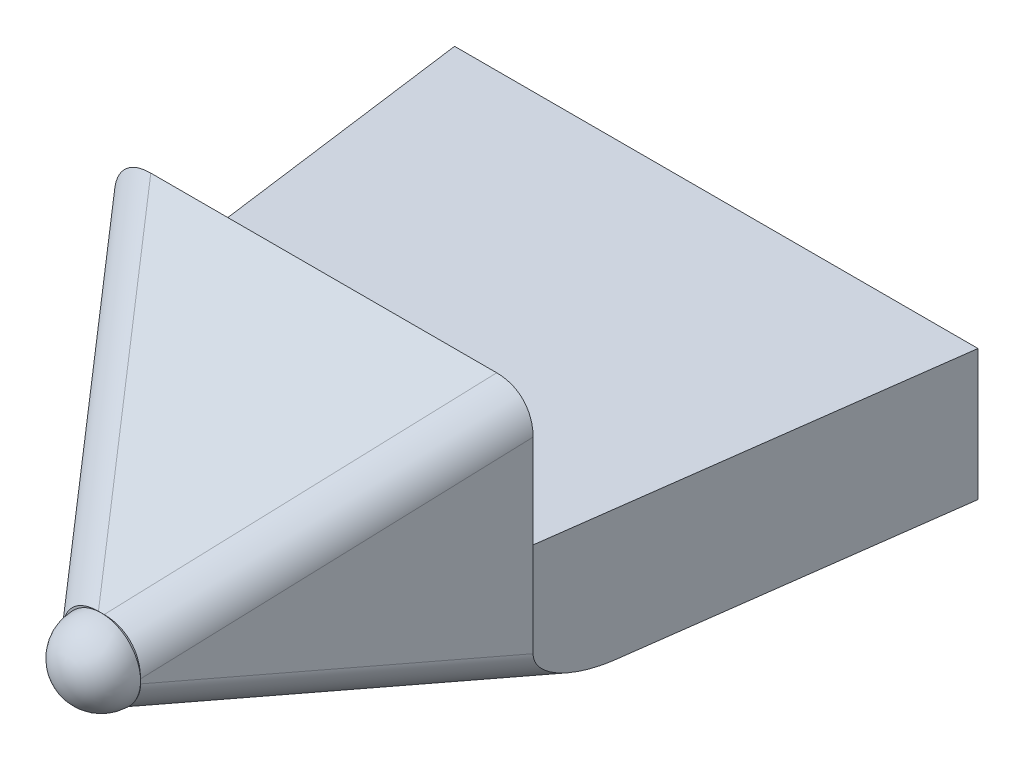
ISO-10303-21;
HEADER;
FILE_DESCRIPTION(('STEP AP214'),'2;1');
FILE_NAME('part.step','',(''),(''),'','','');
FILE_SCHEMA(('AUTOMOTIVE_DESIGN { 1 0 10303 214 1 1 1 1 }'));
ENDSEC;
DATA;
#1=APPLICATION_CONTEXT('core data for automotive mechanical design processes');
#2=APPLICATION_PROTOCOL_DEFINITION('international standard','automotive_design',2000,#1);
#3=PRODUCT_CONTEXT('',#1,'mechanical');
#4=PRODUCT('Part','Part','',(#3));
#5=PRODUCT_RELATED_PRODUCT_CATEGORY('part','',(#4));
#6=PRODUCT_DEFINITION_FORMATION('','',#4);
#7=PRODUCT_DEFINITION_CONTEXT('part definition',#1,'design');
#8=PRODUCT_DEFINITION('design','',#6,#7);
#9=PRODUCT_DEFINITION_SHAPE('','',#8);
#10=(LENGTH_UNIT() NAMED_UNIT(*) SI_UNIT(.MILLI.,.METRE.));
#11=(NAMED_UNIT(*) PLANE_ANGLE_UNIT() SI_UNIT($,.RADIAN.));
#12=(NAMED_UNIT(*) SI_UNIT($,.STERADIAN.) SOLID_ANGLE_UNIT());
#13=UNCERTAINTY_MEASURE_WITH_UNIT(LENGTH_MEASURE(1.E-05),#10,'distance_accuracy_value','');
#14=(GEOMETRIC_REPRESENTATION_CONTEXT(3) GLOBAL_UNCERTAINTY_ASSIGNED_CONTEXT((#13)) GLOBAL_UNIT_ASSIGNED_CONTEXT((#10,
#11,#12)) REPRESENTATION_CONTEXT('',''));
#15=CARTESIAN_POINT('',(0.,0.,0.));
#16=DIRECTION('',(0.,0.,1.));
#17=DIRECTION('',(1.,0.,0.));
#18=AXIS2_PLACEMENT_3D('',#15,#16,#17);
#19=CARTESIAN_POINT('',(850.,1360.,618.303571428571));
#20=DIRECTION('',(0.,0.,1.));
#21=DIRECTION('',(1.,0.,0.));
#22=AXIS2_PLACEMENT_3D('',#19,#20,#21);
#23=PLANE('',#22);
#24=CARTESIAN_POINT('',(1000.,-91.0714285714272,618.303571428571));
#25=DIRECTION('',(0.,0.,1.));
#26=DIRECTION('',(1.,0.,0.));
#27=AXIS2_PLACEMENT_3D('',#24,#25,#26);
#28=CIRCLE('',#27,149.999999999998);
#29=CARTESIAN_POINT('',(1150.,-91.0714285714272,618.303571428571));
#30=VERTEX_POINT('',#29);
#31=CARTESIAN_POINT('',(1130.26166991216,-165.448154445155,618.303571428571));
#32=VERTEX_POINT('',#31);
#33=EDGE_CURVE('E157',#30,#32,#28,.F.);
#34=ORIENTED_EDGE('',*,*,#33,.T.);
#35=CARTESIAN_POINT('',(973.757009513848,-101.071428571429,618.303571428571));
#36=DIRECTION('',(0.,0.,1.));
#37=DIRECTION('',(-1.,0.,0.));
#38=AXIS2_PLACEMENT_3D('',#35,#36,#37);
#39=ELLIPSE('',#38,176.242990486152,140.);
#40=CARTESIAN_POINT('',(1150.,-101.071428571429,618.303571428571));
#41=VERTEX_POINT('',#40);
#42=EDGE_CURVE('E195',#32,#41,#39,.T.);
#43=ORIENTED_EDGE('',*,*,#42,.T.);
#44=DIRECTION('',(0.,-1.,0.));
#45=VECTOR('',#44,1.);
#46=CARTESIAN_POINT('',(1150.,1360.,618.303571428571));
#47=LINE('',#46,#45);
#48=EDGE_CURVE('E402',#30,#41,#47,.T.);
#49=ORIENTED_EDGE('',*,*,#48,.F.);
#50=EDGE_LOOP('',(#34,#43,#49));
#51=FACE_BOUND('',#50,.T.);
#52=ADVANCED_FACE('F39',(#51),#23,.T.);
#53=DIRECTION('',(0.,-1.,0.));
#54=VECTOR('',#53,1.);
#55=CARTESIAN_POINT('',(850.,1360.,618.303571428571));
#56=LINE('',#55,#54);
#57=CARTESIAN_POINT('',(850.,-91.0714285714272,618.303571428571));
#58=VERTEX_POINT('',#57);
#59=CARTESIAN_POINT('',(850.,-101.071428571429,618.303571428571));
#60=VERTEX_POINT('',#59);
#61=EDGE_CURVE('E159',#58,#60,#56,.T.);
#62=ORIENTED_EDGE('',*,*,#61,.T.);
#63=CARTESIAN_POINT('',(1026.24299048615,-101.071428571429,618.303571428572));
#64=DIRECTION('',(0.,0.,1.));
#65=DIRECTION('',(-1.,0.,0.));
#66=AXIS2_PLACEMENT_3D('',#63,#64,#65);
#67=ELLIPSE('',#66,176.242990486152,140.);
#68=CARTESIAN_POINT('',(869.738330087826,-165.448154445129,618.303571428571));
#69=VERTEX_POINT('',#68);
#70=EDGE_CURVE('E200',#60,#69,#67,.T.);
#71=ORIENTED_EDGE('',*,*,#70,.T.);
#72=EDGE_CURVE('E167',#69,#58,#28,.F.);
#73=ORIENTED_EDGE('',*,*,#72,.T.);
#74=EDGE_LOOP('',(#62,#71,#73));
#75=FACE_BOUND('',#74,.T.);
#76=ADVANCED_FACE('F245',(#75),#23,.T.);
#77=DIRECTION('',(-1.,0.,0.));
#78=VECTOR('',#77,1.);
#79=CARTESIAN_POINT('',(2000.,58.9285714285711,618.303571428572));
#80=LINE('',#79,#78);
#81=CARTESIAN_POINT('',(1000.,58.9285714285712,618.303571428571));
#82=VERTEX_POINT('',#81);
#83=CARTESIAN_POINT('',(989.094896995936,58.9285714285711,618.303571428572));
#84=VERTEX_POINT('',#83);
#85=EDGE_CURVE('E146',#82,#84,#80,.T.);
#86=ORIENTED_EDGE('',*,*,#85,.T.);
#87=CARTESIAN_POINT('',(1076.59813062505,-174.253122583085,618.303571428571));
#88=DIRECTION('',(0.,0.,1.));
#89=DIRECTION('',(0.680451099367278,-0.732793491626299,0.));
#90=AXIS2_PLACEMENT_3D('',#87,#88,#89);
#91=ELLIPSE('',#90,270.777427465647,180.);
#92=CARTESIAN_POINT('',(850.,-84.2075772255309,618.303571428571));
#93=VERTEX_POINT('',#92);
#94=EDGE_CURVE('E11',#84,#93,#91,.T.);
#95=ORIENTED_EDGE('',*,*,#94,.T.);
#96=EDGE_CURVE('E163',#93,#58,#56,.T.);
#97=ORIENTED_EDGE('',*,*,#96,.T.);
#98=EDGE_CURVE('E156',#58,#82,#28,.F.);
#99=ORIENTED_EDGE('',*,*,#98,.T.);
#100=EDGE_LOOP('',(#86,#95,#97,#99));
#101=FACE_BOUND('',#100,.T.);
#102=ADVANCED_FACE('F162',(#101),#23,.T.);
#103=CARTESIAN_POINT('',(2000.,-241.071428571429,-1731.69642857143));
#104=DIRECTION('',(0.,1.,0.));
#105=DIRECTION('',(0.,0.,1.));
#106=AXIS2_PLACEMENT_3D('',#103,#104,#105);
#107=PLANE('',#106);
#108=CARTESIAN_POINT('',(1000.,-241.071428571429,-816.014185361011));
#109=DIRECTION('',(0.,-1.,0.));
#110=DIRECTION('',(0.,0.,-1.));
#111=AXIS2_PLACEMENT_3D('',#108,#109,#110);
#112=CIRCLE('',#111,400.);
#113=CARTESIAN_POINT('',(1000.,-241.071428571429,-1216.01418536101));
#114=VERTEX_POINT('',#113);
#115=EDGE_CURVE('E279',#114,#114,#112,.T.);
#116=ORIENTED_EDGE('',*,*,#115,.F.);
#117=EDGE_LOOP('',(#116));
#118=FACE_BOUND('',#117,.T.);
#119=DIRECTION('',(0.132163720091018,0.,-0.991227900682635));
#120=VECTOR('',#119,1.);
#121=CARTESIAN_POINT('',(2000.,-241.071428571429,-1731.69642857143));
#122=LINE('',#121,#120);
#123=CARTESIAN_POINT('',(1837.2190166244,-241.071428571429,-510.839053254464));
#124=VERTEX_POINT('',#123);
#125=CARTESIAN_POINT('',(2000.,-241.071428571429,-1731.69642857143));
#126=VERTEX_POINT('',#125);
#127=EDGE_CURVE('E282',#124,#126,#122,.T.);
#128=ORIENTED_EDGE('',*,*,#127,.F.);
#129=DIRECTION('',(0.607450107570797,0.,-0.794357832977196));
#130=VECTOR('',#129,1.);
#131=CARTESIAN_POINT('',(1038.78990338319,-241.071428571429,533.26055636866));
#132=LINE('',#131,#130);
#133=CARTESIAN_POINT('',(1000.,-241.071428571429,583.985814638988));
#134=VERTEX_POINT('',#133);
#135=EDGE_CURVE('E194',#124,#134,#132,.F.);
#136=ORIENTED_EDGE('',*,*,#135,.T.);
#137=DIRECTION('',(0.607450107570797,0.,0.794357832977196));
#138=VECTOR('',#137,1.);
#139=CARTESIAN_POINT('',(311.210096616808,-241.071428571429,-316.73944363134));
#140=LINE('',#139,#138);
#141=CARTESIAN_POINT('',(162.780983375595,-241.071428571429,-510.839053254463));
#142=VERTEX_POINT('',#141);
#143=EDGE_CURVE('E191',#134,#142,#140,.F.);
#144=ORIENTED_EDGE('',*,*,#143,.T.);
#145=DIRECTION('',(0.132163720091018,0.,0.991227900682635));
#146=VECTOR('',#145,1.);
#147=CARTESIAN_POINT('',(34.934497816594,-241.071428571429,-1469.68769494697));
#148=LINE('',#147,#146);
#149=CARTESIAN_POINT('',(0.,-241.071428571429,-1731.69642857143));
#150=VERTEX_POINT('',#149);
#151=EDGE_CURVE('E318',#150,#142,#148,.T.);
#152=ORIENTED_EDGE('',*,*,#151,.F.);
#153=DIRECTION('',(-1.,0.,0.));
#154=VECTOR('',#153,1.);
#155=CARTESIAN_POINT('',(2000.,-241.071428571429,-1731.69642857143));
#156=LINE('',#155,#154);
#157=EDGE_CURVE('E170',#126,#150,#156,.T.);
#158=ORIENTED_EDGE('',*,*,#157,.F.);
#159=EDGE_LOOP('',(#128,#136,#144,#152,#158));
#160=FACE_BOUND('',#159,.T.);
#161=ADVANCED_FACE('F228',(#118,#160),#107,.F.);
#162=CARTESIAN_POINT('',(2000.,258.928571428571,-231.696428571428));
#163=DIRECTION('',(0.,-1.,0.));
#164=DIRECTION('',(0.,0.,-1.));
#165=AXIS2_PLACEMENT_3D('',#162,#163,#164);
#166=PLANE('',#165);
#167=DIRECTION('',(-0.132163720091018,0.,-0.991227900682635));
#168=VECTOR('',#167,1.);
#169=CARTESIAN_POINT('',(231.441048034935,258.928571428571,4.1114316905804));
#170=LINE('',#169,#168);
#171=CARTESIAN_POINT('',(200.,258.928571428571,-231.696428571428));
#172=VERTEX_POINT('',#171);
#173=CARTESIAN_POINT('',(0.,258.928571428571,-1731.69642857143));
#174=VERTEX_POINT('',#173);
#175=EDGE_CURVE('E312',#172,#174,#170,.T.);
#176=ORIENTED_EDGE('',*,*,#175,.F.);
#177=DIRECTION('',(-1.,0.,0.));
#178=VECTOR('',#177,1.);
#179=CARTESIAN_POINT('',(2000.,258.928571428571,-231.696428571428));
#180=LINE('',#179,#178);
#181=CARTESIAN_POINT('',(1800.,258.928571428571,-231.696428571428));
#182=VERTEX_POINT('',#181);
#183=EDGE_CURVE('E179',#182,#172,#180,.T.);
#184=ORIENTED_EDGE('',*,*,#183,.F.);
#185=DIRECTION('',(-0.132163720091018,0.,0.991227900682635));
#186=VECTOR('',#185,1.);
#187=CARTESIAN_POINT('',(1803.49344978166,258.928571428571,-257.897301933874));
#188=LINE('',#187,#186);
#189=CARTESIAN_POINT('',(2000.,258.928571428571,-1731.69642857143));
#190=VERTEX_POINT('',#189);
#191=EDGE_CURVE('E286',#190,#182,#188,.T.);
#192=ORIENTED_EDGE('',*,*,#191,.F.);
#193=DIRECTION('',(-1.,0.,0.));
#194=VECTOR('',#193,1.);
#195=CARTESIAN_POINT('',(2000.,258.928571428571,-1731.69642857143));
#196=LINE('',#195,#194);
#197=EDGE_CURVE('E182',#190,#174,#196,.T.);
#198=ORIENTED_EDGE('',*,*,#197,.T.);
#199=EDGE_LOOP('',(#176,#184,#192,#198));
#200=FACE_BOUND('',#199,.T.);
#201=ADVANCED_FACE('F266',(#200),#166,.F.);
#202=CARTESIAN_POINT('',(2000.,758.928571428571,-231.696428571428));
#203=DIRECTION('',(0.,0.,1.));
#204=DIRECTION('',(0.,-1.,0.));
#205=AXIS2_PLACEMENT_3D('',#202,#203,#204);
#206=PLANE('',#205);
#207=DIRECTION('',(-1.,0.,0.));
#208=VECTOR('',#207,1.);
#209=CARTESIAN_POINT('',(2000.,758.928571428571,-231.696428571428));
#210=LINE('',#209,#208);
#211=CARTESIAN_POINT('',(1660.90510300406,758.928571428571,-231.696428571428));
#212=VERTEX_POINT('',#211);
#213=CARTESIAN_POINT('',(339.094896995936,758.928571428571,-231.696428571428));
#214=VERTEX_POINT('',#213);
#215=EDGE_CURVE('E150',#212,#214,#210,.T.);
#216=ORIENTED_EDGE('',*,*,#215,.F.);
#217=CARTESIAN_POINT('',(1573.40186937495,525.746877416916,-231.696428571428));
#218=DIRECTION('',(0.,0.,1.));
#219=DIRECTION('',(0.680451099367278,0.732793491626299,0.));
#220=AXIS2_PLACEMENT_3D('',#217,#218,#219);
#221=ELLIPSE('',#220,270.777427465647,180.);
#222=CARTESIAN_POINT('',(1800.,615.792422774469,-231.696428571428));
#223=VERTEX_POINT('',#222);
#224=EDGE_CURVE('E308',#212,#223,#221,.F.);
#225=ORIENTED_EDGE('',*,*,#224,.T.);
#226=DIRECTION('',(0.,-1.,0.));
#227=VECTOR('',#226,1.);
#228=CARTESIAN_POINT('',(1800.,1360.,-231.696428571428));
#229=LINE('',#228,#227);
#230=EDGE_CURVE('E319',#223,#182,#229,.T.);
#231=ORIENTED_EDGE('',*,*,#230,.T.);
#232=ORIENTED_EDGE('',*,*,#183,.T.);
#233=DIRECTION('',(0.,-1.,0.));
#234=VECTOR('',#233,1.);
#235=CARTESIAN_POINT('',(200.,1360.,-231.696428571428));
#236=LINE('',#235,#234);
#237=CARTESIAN_POINT('',(200.,615.792422774469,-231.696428571428));
#238=VERTEX_POINT('',#237);
#239=EDGE_CURVE('E309',#238,#172,#236,.T.);
#240=ORIENTED_EDGE('',*,*,#239,.F.);
#241=CARTESIAN_POINT('',(426.598130625052,525.746877416916,-231.696428571428));
#242=DIRECTION('',(0.,0.,1.));
#243=DIRECTION('',(0.680451099367278,-0.732793491626299,0.));
#244=AXIS2_PLACEMENT_3D('',#241,#242,#243);
#245=ELLIPSE('',#244,270.777427465647,180.);
#246=EDGE_CURVE('E58',#238,#214,#245,.F.);
#247=ORIENTED_EDGE('',*,*,#246,.T.);
#248=EDGE_LOOP('',(#216,#225,#231,#232,#240,#247));
#249=FACE_BOUND('',#248,.T.);
#250=ADVANCED_FACE('F275',(#249),#206,.F.);
#251=CARTESIAN_POINT('',(2000.,58.9285714285711,618.303571428572));
#252=DIRECTION('',(0.,-0.77193023561705,-0.6357072528611));
#253=DIRECTION('',(0.,0.6357072528611,-0.77193023561705));
#254=AXIS2_PLACEMENT_3D('',#251,#252,#253);
#255=PLANE('',#254);
#256=CARTESIAN_POINT('',(1010.90510300406,58.9285714285711,618.303571428572));
#257=VERTEX_POINT('',#256);
#258=EDGE_CURVE('E137',#257,#82,#80,.T.);
#259=ORIENTED_EDGE('',*,*,#258,.F.);
#260=DIRECTION('',(-0.508340226553754,-0.547443320904043,0.664752603954909));
#261=VECTOR('',#260,1.);
#262=CARTESIAN_POINT('',(1696.84858556112,797.636937259245,-278.69944422296));
#263=LINE('',#262,#261);
#264=EDGE_CURVE('E304',#257,#212,#263,.F.);
#265=ORIENTED_EDGE('',*,*,#264,.T.);
#266=ORIENTED_EDGE('',*,*,#215,.T.);
#267=DIRECTION('',(-0.508340226553754,0.547443320904043,-0.664752603954909));
#268=VECTOR('',#267,1.);
#269=CARTESIAN_POINT('',(953.151414438882,97.6369372592446,571.30055577704));
#270=LINE('',#269,#268);
#271=EDGE_CURVE('E172',#214,#84,#270,.F.);
#272=ORIENTED_EDGE('',*,*,#271,.T.);
#273=ORIENTED_EDGE('',*,*,#85,.F.);
#274=EDGE_LOOP('',(#259,#265,#266,#272,#273));
#275=FACE_BOUND('',#274,.T.);
#276=ADVANCED_FACE('F166',(#275),#255,.F.);
#277=CARTESIAN_POINT('',(2000.,258.928571428571,-1731.69642857143));
#278=DIRECTION('',(0.,0.,1.));
#279=DIRECTION('',(1.,0.,0.));
#280=AXIS2_PLACEMENT_3D('',#277,#278,#279);
#281=PLANE('',#280);
#282=DIRECTION('',(0.,1.,0.));
#283=VECTOR('',#282,1.);
#284=CARTESIAN_POINT('',(0.,258.928571428571,-1731.69642857143));
#285=LINE('',#284,#283);
#286=EDGE_CURVE('E173',#150,#174,#285,.T.);
#287=ORIENTED_EDGE('',*,*,#286,.T.);
#288=ORIENTED_EDGE('',*,*,#197,.F.);
#289=DIRECTION('',(0.,1.,0.));
#290=VECTOR('',#289,1.);
#291=CARTESIAN_POINT('',(2000.,258.928571428571,-1731.69642857143));
#292=LINE('',#291,#290);
#293=EDGE_CURVE('E175',#126,#190,#292,.T.);
#294=ORIENTED_EDGE('',*,*,#293,.F.);
#295=ORIENTED_EDGE('',*,*,#157,.T.);
#296=EDGE_LOOP('',(#287,#288,#294,#295));
#297=FACE_BOUND('',#296,.T.);
#298=ADVANCED_FACE('F336',(#297),#281,.F.);
#299=CARTESIAN_POINT('',(200.,1360.,-231.696428571428));
#300=DIRECTION('',(-0.794357832977196,0.,0.607450107570797));
#301=DIRECTION('',(0.607450107570797,0.,0.794357832977196));
#302=AXIS2_PLACEMENT_3D('',#299,#300,#301);
#303=PLANE('',#302);
#304=ORIENTED_EDGE('',*,*,#96,.F.);
#305=DIRECTION('',(-0.508340226553754,0.547443320904043,-0.664752603954909));
#306=VECTOR('',#305,1.);
#307=CARTESIAN_POINT('',(160.167004502987,658.689494848176,-283.785730375215));
#308=LINE('',#307,#306);
#309=EDGE_CURVE('E50',#93,#238,#308,.T.);
#310=ORIENTED_EDGE('',*,*,#309,.T.);
#311=ORIENTED_EDGE('',*,*,#239,.T.);
#312=CARTESIAN_POINT('',(200.,-101.071428571429,-231.696428571428));
#313=VERTEX_POINT('',#312);
#314=EDGE_CURVE('E316',#172,#313,#236,.T.);
#315=ORIENTED_EDGE('',*,*,#314,.T.);
#316=DIRECTION('',(0.607450107570797,0.,0.794357832977196));
#317=VECTOR('',#316,1.);
#318=CARTESIAN_POINT('',(850.,-101.071428571429,618.303571428571));
#319=LINE('',#318,#317);
#320=EDGE_CURVE('E197',#313,#60,#319,.T.);
#321=ORIENTED_EDGE('',*,*,#320,.T.);
#322=ORIENTED_EDGE('',*,*,#61,.F.);
#323=EDGE_LOOP('',(#304,#310,#311,#315,#321,#322));
#324=FACE_BOUND('',#323,.T.);
#325=ADVANCED_FACE('F259',(#324),#303,.T.);
#326=CARTESIAN_POINT('',(1800.,1360.,-231.696428571428));
#327=DIRECTION('',(0.794357832977196,0.,0.607450107570797));
#328=DIRECTION('',(0.607450107570797,0.,-0.794357832977196));
#329=AXIS2_PLACEMENT_3D('',#326,#327,#328);
#330=PLANE('',#329);
#331=ORIENTED_EDGE('',*,*,#230,.F.);
#332=DIRECTION('',(-0.508340226553754,-0.547443320904043,0.664752603954909));
#333=VECTOR('',#332,1.);
#334=CARTESIAN_POINT('',(1189.83299549701,-41.3105051518244,566.214269624785));
#335=LINE('',#334,#333);
#336=CARTESIAN_POINT('',(1150.,-84.2075772255309,618.303571428571));
#337=VERTEX_POINT('',#336);
#338=EDGE_CURVE('E298',#223,#337,#335,.T.);
#339=ORIENTED_EDGE('',*,*,#338,.T.);
#340=EDGE_CURVE('E333',#337,#30,#47,.T.);
#341=ORIENTED_EDGE('',*,*,#340,.T.);
#342=ORIENTED_EDGE('',*,*,#48,.T.);
#343=DIRECTION('',(0.607450107570797,0.,-0.794357832977196));
#344=VECTOR('',#343,1.);
#345=CARTESIAN_POINT('',(1800.,-101.071428571429,-231.696428571428));
#346=LINE('',#345,#344);
#347=CARTESIAN_POINT('',(1800.,-101.071428571429,-231.696428571428));
#348=VERTEX_POINT('',#347);
#349=EDGE_CURVE('E187',#41,#348,#346,.T.);
#350=ORIENTED_EDGE('',*,*,#349,.T.);
#351=EDGE_CURVE('E325',#182,#348,#229,.T.);
#352=ORIENTED_EDGE('',*,*,#351,.F.);
#353=EDGE_LOOP('',(#331,#339,#341,#342,#350,#352));
#354=FACE_BOUND('',#353,.T.);
#355=ADVANCED_FACE('F253',(#354),#330,.T.);
#356=ORIENTED_EDGE('',*,*,#340,.F.);
#357=CARTESIAN_POINT('',(923.401869374948,-174.253122583085,618.303571428571));
#358=DIRECTION('',(0.,0.,1.));
#359=DIRECTION('',(0.680451099367278,0.732793491626299,0.));
#360=AXIS2_PLACEMENT_3D('',#357,#358,#359);
#361=ELLIPSE('',#360,270.777427465647,180.);
#362=EDGE_CURVE('E141',#337,#257,#361,.T.);
#363=ORIENTED_EDGE('',*,*,#362,.T.);
#364=ORIENTED_EDGE('',*,*,#258,.T.);
#365=CARTESIAN_POINT('',(1000.,-91.0714285714288,618.303571428571));
#366=DIRECTION('',(0.,0.,1.));
#367=DIRECTION('',(1.,0.,0.));
#368=AXIS2_PLACEMENT_3D('',#365,#366,#367);
#369=CIRCLE('',#368,150.);
#370=EDGE_CURVE('E143',#30,#82,#369,.T.);
#371=ORIENTED_EDGE('',*,*,#370,.F.);
#372=EDGE_LOOP('',(#356,#363,#364,#371));
#373=FACE_BOUND('',#372,.T.);
#374=ADVANCED_FACE('F140',(#373),#23,.T.);
#375=CARTESIAN_POINT('',(2000.,1360.,-1731.69642857143));
#376=DIRECTION('',(0.991227900682635,0.,0.132163720091018));
#377=DIRECTION('',(0.132163720091018,0.,-0.991227900682635));
#378=AXIS2_PLACEMENT_3D('',#375,#376,#377);
#379=PLANE('',#378);
#380=ORIENTED_EDGE('',*,*,#351,.T.);
#381=CARTESIAN_POINT('',(1837.2190166244,-101.071428571429,-510.839053254464));
#382=DIRECTION('',(0.991227900682635,0.,0.132163720091018));
#383=DIRECTION('',(-0.132163720091018,0.,0.991227900682635));
#384=AXIS2_PLACEMENT_3D('',#381,#382,#383);
#385=ELLIPSE('',#384,281.612961550816,140.);
#386=EDGE_CURVE('E189',#348,#124,#385,.T.);
#387=ORIENTED_EDGE('',*,*,#386,.T.);
#388=ORIENTED_EDGE('',*,*,#127,.T.);
#389=ORIENTED_EDGE('',*,*,#293,.T.);
#390=ORIENTED_EDGE('',*,*,#191,.T.);
#391=EDGE_LOOP('',(#380,#387,#388,#389,#390));
#392=FACE_BOUND('',#391,.T.);
#393=ADVANCED_FACE('F250',(#392),#379,.T.);
#394=CARTESIAN_POINT('',(0.,1360.,-1731.69642857143));
#395=DIRECTION('',(-0.991227900682635,0.,0.132163720091018));
#396=DIRECTION('',(0.132163720091018,0.,0.991227900682635));
#397=AXIS2_PLACEMENT_3D('',#394,#395,#396);
#398=PLANE('',#397);
#399=ORIENTED_EDGE('',*,*,#151,.T.);
#400=CARTESIAN_POINT('',(162.780983375595,-101.071428571429,-510.839053254464));
#401=DIRECTION('',(-0.991227900682635,0.,0.132163720091018));
#402=DIRECTION('',(-0.132163720091018,0.,-0.991227900682635));
#403=AXIS2_PLACEMENT_3D('',#400,#401,#402);
#404=ELLIPSE('',#403,281.612961550816,140.);
#405=EDGE_CURVE('E203',#142,#313,#404,.T.);
#406=ORIENTED_EDGE('',*,*,#405,.T.);
#407=ORIENTED_EDGE('',*,*,#314,.F.);
#408=ORIENTED_EDGE('',*,*,#175,.T.);
#409=ORIENTED_EDGE('',*,*,#286,.F.);
#410=EDGE_LOOP('',(#399,#406,#407,#408,#409));
#411=FACE_BOUND('',#410,.T.);
#412=ADVANCED_FACE('F258',(#411),#398,.T.);
#413=CARTESIAN_POINT('',(1000.,-91.0714285714272,618.303571428571));
#414=DIRECTION('',(0.,0.,1.));
#415=DIRECTION('',(0.,1.,0.));
#416=AXIS2_PLACEMENT_3D('',#413,#414,#415);
#417=SPHERICAL_SURFACE('',#416,149.999999999998);
#418=ORIENTED_EDGE('',*,*,#370,.T.);
#419=ORIENTED_EDGE('',*,*,#98,.F.);
#420=ORIENTED_EDGE('',*,*,#72,.F.);
#421=CARTESIAN_POINT('',(869.738330087892,-165.448154445242,618.303571428571));
#422=CARTESIAN_POINT('',(870.758743550269,-167.235339995722,618.114521033132));
#423=CARTESIAN_POINT('',(871.815654469159,-169.000198682111,617.911642406449));
#424=CARTESIAN_POINT('',(874.000439322856,-172.482121263064,617.480009201347));
#425=CARTESIAN_POINT('',(875.128311401519,-174.199186406081,617.251255299626));
#426=CARTESIAN_POINT('',(877.452781648917,-177.582098266471,616.769695557359));
#427=CARTESIAN_POINT('',(878.64936447191,-179.247956293737,616.516895079118));
#428=CARTESIAN_POINT('',(881.109368880037,-182.52595269314,615.989148807261));
#429=CARTESIAN_POINT('',(882.372790767503,-184.138090822232,615.714202913472));
#430=CARTESIAN_POINT('',(884.960878879633,-187.301728646965,615.145000914968));
#431=CARTESIAN_POINT('',(886.28537620374,-188.853375970307,614.850797219332));
#432=CARTESIAN_POINT('',(888.996416211502,-191.897894531095,614.244666524566));
#433=CARTESIAN_POINT('',(890.382959095656,-193.390765578576,613.932739468162));
#434=CARTESIAN_POINT('',(893.215769865051,-196.315309868122,613.293555883172));
#435=CARTESIAN_POINT('',(894.662038005796,-197.746982848329,612.966299289003));
#436=CARTESIAN_POINT('',(897.611914728193,-200.546869302256,612.299033994307));
#437=CARTESIAN_POINT('',(899.115523305579,-201.915082780699,611.959025294727));
#438=CARTESIAN_POINT('',(902.177004685021,-204.585400958164,611.269180512148));
#439=CARTESIAN_POINT('',(903.734854206951,-205.88753344342,610.919348657408));
#440=CARTESIAN_POINT('',(906.902959059896,-208.424409545683,610.2127235066));
#441=CARTESIAN_POINT('',(908.513214443438,-209.65915309514,609.855930203555));
#442=CARTESIAN_POINT('',(911.783769492885,-212.059626653648,609.138622691447));
#443=CARTESIAN_POINT('',(913.444073236171,-213.225351016728,608.778108180804));
#444=CARTESIAN_POINT('',(916.812076309986,-215.486139091038,608.056971786318));
#445=CARTESIAN_POINT('',(918.519775469083,-216.581203057804,607.696349902868));
#446=CARTESIAN_POINT('',(921.981658584024,-218.700326330873,606.978623015097));
#447=CARTESIAN_POINT('',(923.735884515653,-219.724318281354,606.621521614847));
#448=CARTESIAN_POINT('',(927.286764489871,-221.699049862019,605.915608654258));
#449=CARTESIAN_POINT('',(929.083419208977,-222.649788323166,605.566797226279));
#450=CARTESIAN_POINT('',(932.716057684221,-224.476817593797,604.882587720869));
#451=CARTESIAN_POINT('',(934.552030667064,-225.353128477915,604.547186039557));
#452=CARTESIAN_POINT('',(938.261131451863,-227.030860776975,603.895461707951));
#453=CARTESIAN_POINT('',(940.134257142532,-227.83228643274,603.579137977614));
#454=CARTESIAN_POINT('',(943.377105407794,-229.142482834696,603.058668343576));
#455=CARTESIAN_POINT('',(944.738421705563,-229.669642475029,602.848212761813));
#456=CARTESIAN_POINT('',(947.477752675907,-230.685337734781,602.443414553616));
#457=CARTESIAN_POINT('',(948.855766994648,-231.173874170987,602.249071586436));
#458=CARTESIAN_POINT('',(951.627713337098,-232.112400795233,601.879756535859));
#459=CARTESIAN_POINT('',(953.021648151447,-232.562384104178,601.704787907834));
#460=CARTESIAN_POINT('',(955.82409667111,-233.423785475083,601.378098832149));
#461=CARTESIAN_POINT('',(957.232610329492,-233.835203661145,601.226378309677));
#462=CARTESIAN_POINT('',(960.058100406267,-234.618285310577,600.951190090128));
#463=CARTESIAN_POINT('',(961.47503054323,-234.990081679707,600.827626248412));
#464=CARTESIAN_POINT('',(964.320747989038,-235.695807114709,600.613447708235));
#465=CARTESIAN_POINT('',(965.749534863496,-236.029737561328,600.522831808089));
#466=CARTESIAN_POINT('',(968.616498667434,-236.659955721965,600.38111154245));
#467=CARTESIAN_POINT('',(970.054669602123,-236.956265385262,600.329984048698));
#468=CARTESIAN_POINT('',(972.938889478606,-237.511965492635,600.275192679527));
#469=CARTESIAN_POINT('',(974.384936959228,-237.771362557367,600.271520281905));
#470=CARTESIAN_POINT('',(976.881821568193,-238.187321006853,600.314852580592));
#471=CARTESIAN_POINT('',(977.931467326519,-238.352493653165,600.348136241688));
#472=CARTESIAN_POINT('',(980.031835219265,-238.664245881309,600.449656567732));
#473=CARTESIAN_POINT('',(981.08255728876,-238.810826524899,600.517891235562));
#474=CARTESIAN_POINT('',(983.184919454213,-239.086057997726,600.695155024844));
#475=CARTESIAN_POINT('',(984.236557803977,-239.214676115129,600.804257274486));
#476=CARTESIAN_POINT('',(986.335930003859,-239.454164427862,601.070153253693));
#477=CARTESIAN_POINT('',(987.383663861647,-239.565034658077,601.226946889515));
#478=CARTESIAN_POINT('',(989.481958356614,-239.770684308731,601.598491368059));
#479=CARTESIAN_POINT('',(990.532434557061,-239.865283896714,601.813829482157));
#480=CARTESIAN_POINT('',(992.619154938356,-240.037706644761,602.312026103454));
#481=CARTESIAN_POINT('',(993.655395816562,-240.1155259713,602.594900008465));
#482=CARTESIAN_POINT('',(995.70159415969,-240.255018898324,603.239322552922));
#483=CARTESIAN_POINT('',(996.711615778092,-240.316736090256,603.600653824499));
#484=CARTESIAN_POINT('',(998.69422247217,-240.425206655429,604.41488617715));
#485=CARTESIAN_POINT('',(999.666836054059,-240.471971629818,604.86771581893));
#486=CARTESIAN_POINT('',(1001.76762743104,-240.560477283115,605.99046818365));
#487=CARTESIAN_POINT('',(1002.8826564689,-240.598821200761,606.686253366451));
#488=CARTESIAN_POINT('',(1004.46043648125,-240.642116790513,607.856367252191));
#489=CARTESIAN_POINT('',(1004.97051854913,-240.654178063372,608.267425957944));
#490=CARTESIAN_POINT('',(1005.95366989883,-240.673756077012,609.131598566238));
#491=CARTESIAN_POINT('',(1006.42675616071,-240.681274913435,609.584692964269));
#492=CARTESIAN_POINT('',(1007.33376160353,-240.691931141711,610.534682797835));
#493=CARTESIAN_POINT('',(1007.76738448226,-240.695037597795,611.031861780794));
#494=CARTESIAN_POINT('',(1008.58730659744,-240.696826209684,612.063949156086));
#495=CARTESIAN_POINT('',(1008.97360031693,-240.695507850216,612.598861935449));
#496=CARTESIAN_POINT('',(1009.6958666094,-240.688422911924,613.701445139336));
#497=CARTESIAN_POINT('',(1010.03184567777,-240.682656907864,614.269111322417));
#498=CARTESIAN_POINT('',(1010.65247872984,-240.666580447895,615.431457549204));
#499=CARTESIAN_POINT('',(1010.93715556482,-240.656272022378,616.026125417181));
#500=CARTESIAN_POINT('',(1011.31452524365,-240.637864779143,616.90631199415));
#501=CARTESIAN_POINT('',(1011.42721994525,-240.631629171728,617.18347586396));
#502=CARTESIAN_POINT('',(1011.64218827725,-240.618184102551,617.741050355388));
#503=CARTESIAN_POINT('',(1011.74448565694,-240.610976951831,618.021451870668));
#504=CARTESIAN_POINT('',(1011.84184056482,-240.603267361823,618.30357142856));
#505=B_SPLINE_CURVE_WITH_KNOTS('',3,(#421,#422,#423,#424,#425,#426,#427,#428,#429,#430,#431,
#432,#433,#434,#435,#436,#437,#438,#439,#440,#441,#442,#443,#444,#445,#446,#447,#448,#449,#450,
#451,#452,#453,#454,#455,#456,#457,#458,#459,#460,#461,#462,#463,#464,#465,#466,#467,#468,#469,
#470,#471,#472,#473,#474,#475,#476,#477,#478,#479,#480,#481,#482,#483,#484,#485,#486,#487,#488,
#489,#490,#491,#492,#493,#494,#495,#496,#497,#498,#499,#500,#501,#502,#503,#504),.UNSPECIFIED.,
.F.,.F.,(4,2,2,2,2,2,2,2,2,2,2,2,2,2,2,2,2,2,2,2,2,2,2,2,2,2,2,2,2,2,2,2,2,2,2,2,2,2,2,2,2,4),
(0.,6.19941140791861,12.3986607240963,18.5965308549949,24.7944290230507,30.9761099091758,
37.1578107727231,43.3395380842112,49.5212649357993,55.7003705368831,61.879482331685,
68.0590988995191,74.2386931182733,80.4240660301211,86.6095376326446,92.7933355539335,
98.9767830681338,103.400894628299,107.824912604253,112.249718327858,116.674509812149,
121.083957976052,125.493245301573,129.899948156329,134.305859624313,137.4944801365,
140.682918469608,143.877089642614,147.071254537306,150.298724904671,153.526931822484,
156.74630651552,159.963177259293,163.891269831675,165.854886040734,167.817595648133,
169.793999266564,171.770633046776,173.747011432255,175.722507302407,176.620136170129,
177.515666304839),.UNSPECIFIED.);
#506=CARTESIAN_POINT('',(1000.,-240.48519873981,605.054975877752));
#507=VERTEX_POINT('',#506);
#508=EDGE_CURVE('E211',#69,#507,#505,.T.);
#509=ORIENTED_EDGE('',*,*,#508,.T.);
#510=CARTESIAN_POINT('',(988.158159435179,-240.603267361823,618.303571428571));
#511=CARTESIAN_POINT('',(988.36463690152,-240.619629886768,617.704637378289));
#512=CARTESIAN_POINT('',(988.593852083606,-240.633741549132,617.11320526677));
#513=CARTESIAN_POINT('',(989.098899362203,-240.657620158923,615.950086931258));
#514=CARTESIAN_POINT('',(989.37476163843,-240.667384278625,615.378413781151));
#515=CARTESIAN_POINT('',(989.972462742674,-240.682665181963,614.263175727659));
#516=CARTESIAN_POINT('',(990.294061836439,-240.688203209662,613.719483219784));
#517=CARTESIAN_POINT('',(990.983261804786,-240.695196626919,612.662250189116));
#518=CARTESIAN_POINT('',(991.35084933365,-240.696653198047,612.148700982085));
#519=CARTESIAN_POINT('',(992.131078755869,-240.695509299792,611.154061014584));
#520=CARTESIAN_POINT('',(992.543878141907,-240.692894200345,610.673093812046));
#521=CARTESIAN_POINT('',(993.409740366016,-240.683535149267,609.748610156203));
#522=CARTESIAN_POINT('',(993.862820215476,-240.676789446037,609.305109681664));
#523=CARTESIAN_POINT('',(994.804157957241,-240.65906522988,608.457595177158));
#524=CARTESIAN_POINT('',(995.292407344813,-240.648087737513,608.053571656153));
#525=CARTESIAN_POINT('',(996.299048933173,-240.621744523973,607.285069861269));
#526=CARTESIAN_POINT('',(996.817449692341,-240.60637755197,606.920602900375));
#527=CARTESIAN_POINT('',(998.084082976093,-240.564250771803,606.097194785354));
#528=CARTESIAN_POINT('',(998.843833859702,-240.535382828562,605.656043598373));
#529=CARTESIAN_POINT('',(1000.39905272059,-240.468292777238,604.842901934819));
#530=CARTESIAN_POINT('',(1001.19453648934,-240.43006649954,604.470942417018));
#531=CARTESIAN_POINT('',(1002.81355364423,-240.343566146755,603.788446686214));
#532=CARTESIAN_POINT('',(1003.63716577607,-240.29526152982,603.478102908039));
#533=CARTESIAN_POINT('',(1005.30235006919,-240.18814061456,602.913079520257));
#534=CARTESIAN_POINT('',(1006.14392137091,-240.129324818326,602.658397253148));
#535=CARTESIAN_POINT('',(1007.78351875633,-240.004927532143,602.212990620631));
#536=CARTESIAN_POINT('',(1008.58076461314,-239.940046264809,602.019159692282));
#537=CARTESIAN_POINT('',(1010.18267909246,-239.800314397905,601.669005672436));
#538=CARTESIAN_POINT('',(1010.98734914716,-239.725461835701,601.512689982009));
#539=CARTESIAN_POINT('',(1012.60189943082,-239.565429158349,601.23306881815));
#540=CARTESIAN_POINT('',(1013.41178286951,-239.480241958273,601.109786178488));
#541=CARTESIAN_POINT('',(1015.03430157496,-239.299300218407,600.892481704508));
#542=CARTESIAN_POINT('',(1015.84693702324,-239.203544967853,600.798461839909));
#543=CARTESIAN_POINT('',(1017.47508129396,-239.001023433736,600.63616014398));
#544=CARTESIAN_POINT('',(1018.29059259395,-238.894235032448,600.567931341632));
#545=CARTESIAN_POINT('',(1019.92165810328,-238.669605813541,600.454576003216));
#546=CARTESIAN_POINT('',(1020.73721231268,-238.551764979087,600.409449502342));
#547=CARTESIAN_POINT('',(1023.1820578776,-238.181454725358,600.304861608814));
#548=CARTESIAN_POINT('',(1024.81017459386,-237.912118142202,600.276132137441));
#549=CARTESIAN_POINT('',(1028.14871368596,-237.310942633571,600.284387881741));
#550=CARTESIAN_POINT('',(1029.8586322766,-236.976445916484,600.325148121433));
#551=CARTESIAN_POINT('',(1033.26518977249,-236.254943726978,600.465108541764));
#552=CARTESIAN_POINT('',(1034.96182603891,-235.867928087152,600.564320050742));
#553=CARTESIAN_POINT('',(1038.33987102497,-235.040417653261,600.809971593457));
#554=CARTESIAN_POINT('',(1040.02126694017,-234.599881692595,600.956448127611));
#555=CARTESIAN_POINT('',(1043.36510853506,-233.665138044711,601.287626510193));
#556=CARTESIAN_POINT('',(1045.02755538682,-233.170933697225,601.47232598069));
#557=CARTESIAN_POINT('',(1048.33274178989,-232.128232117834,601.872829990747));
#558=CARTESIAN_POINT('',(1049.97546753339,-231.579699079813,602.088655087411));
#559=CARTESIAN_POINT('',(1053.23833160096,-230.428532335989,602.545312272458));
#560=CARTESIAN_POINT('',(1054.8584696806,-229.825898045276,602.786144631209));
#561=CARTESIAN_POINT('',(1058.07396078386,-228.566813989882,603.287675086737));
#562=CARTESIAN_POINT('',(1059.66932153795,-227.910381428361,603.548366831181));
#563=CARTESIAN_POINT('',(1062.83417670226,-226.543756694158,604.085354237444));
#564=CARTESIAN_POINT('',(1064.40367097277,-225.833564231239,604.361649983502));
#565=CARTESIAN_POINT('',(1067.64165469679,-224.299878832987,604.949011313975));
#566=CARTESIAN_POINT('',(1069.30782494296,-223.471868633848,605.2610778699));
#567=CARTESIAN_POINT('',(1072.60611262081,-221.753999621321,605.894864833964));
#568=CARTESIAN_POINT('',(1074.238229626,-220.864140033896,606.216585362893));
#569=CARTESIAN_POINT('',(1077.46662973144,-219.023225777041,606.866019266422));
#570=CARTESIAN_POINT('',(1079.06290851173,-218.072163783077,607.193733354942));
#571=CARTESIAN_POINT('',(1082.21746764822,-216.109851494265,607.851799345091));
#572=CARTESIAN_POINT('',(1083.77574814821,-215.098601427207,608.182151236732));
#573=CARTESIAN_POINT('',(1086.85120266312,-213.017749348026,608.842241834599));
#574=CARTESIAN_POINT('',(1088.36840704399,-211.948192306263,609.171980816106));
#575=CARTESIAN_POINT('',(1091.36101390498,-209.75120490149,609.828363425662));
#576=CARTESIAN_POINT('',(1092.83641634175,-208.623774478469,610.155007050501));
#577=CARTESIAN_POINT('',(1095.74345397004,-206.312396156507,610.802672347552));
#578=CARTESIAN_POINT('',(1097.1750907143,-205.128450266472,611.123694219042));
#579=CARTESIAN_POINT('',(1099.99275979947,-202.705446435936,611.757801611243));
#580=CARTESIAN_POINT('',(1101.37879221134,-201.4663885812,612.070887144304));
#581=CARTESIAN_POINT('',(1104.09188548558,-198.945416000668,612.684359502407));
#582=CARTESIAN_POINT('',(1105.41934545469,-197.663951462663,612.984831227122));
#583=CARTESIAN_POINT('',(1108.02580940958,-195.050021741379,613.573881617491));
#584=CARTESIAN_POINT('',(1109.30481346371,-193.717556630047,613.862460299922));
#585=CARTESIAN_POINT('',(1111.81259420605,-191.003407860156,614.425881623863));
#586=CARTESIAN_POINT('',(1113.04137179872,-189.62172508873,614.700724512742));
#587=CARTESIAN_POINT('',(1115.44701308467,-186.810991770862,615.234957887343));
#588=CARTESIAN_POINT('',(1116.62387690665,-185.381941341868,615.494348411374));
#589=CARTESIAN_POINT('',(1118.92630732375,-182.475575622939,615.996560503948));
#590=CARTESIAN_POINT('',(1120.05176788622,-180.998170484978,616.239348296101));
#591=CARTESIAN_POINT('',(1122.24728416986,-177.999889080294,616.706271809626));
#592=CARTESIAN_POINT('',(1123.31734009177,-176.479012971101,616.930407598578));
#593=CARTESIAN_POINT('',(1125.40066976928,-173.395707564704,617.358638313881));
#594=CARTESIAN_POINT('',(1126.4139335933,-171.833271069596,617.562729739619));
#595=CARTESIAN_POINT('',(1128.38201416499,-168.669385959299,617.949522194572));
#596=CARTESIAN_POINT('',(1129.33682978136,-167.067936589833,618.132222809819));
#597=CARTESIAN_POINT('',(1130.26166991215,-165.448154445169,618.303571428572));
#598=B_SPLINE_CURVE_WITH_KNOTS('',3,(#510,#511,#512,#513,#514,#515,#516,#517,#518,#519,#520,
#521,#522,#523,#524,#525,#526,#527,#528,#529,#530,#531,#532,#533,#534,#535,#536,#537,#538,#539,
#540,#541,#542,#543,#544,#545,#546,#547,#548,#549,#550,#551,#552,#553,#554,#555,#556,#557,#558,
#559,#560,#561,#562,#563,#564,#565,#566,#567,#568,#569,#570,#571,#572,#573,#574,#575,#576,#577,
#578,#579,#580,#581,#582,#583,#584,#585,#586,#587,#588,#589,#590,#591,#592,#593,#594,#595,#596,
#597),.UNSPECIFIED.,.F.,.F.,(4,2,2,2,2,2,2,2,2,2,2,2,2,2,2,2,2,2,2,2,2,2,2,2,2,2,2,2,2,2,2,2,2,
2,2,2,2,2,2,2,2,2,2,4),(0.,1.90115169401036,3.80353813370456,5.6962973343312,7.58850853004053,
9.48753440360932,11.3873661253543,13.2867399603449,15.186655583519,17.8194594580552,
20.4534385224967,23.0955187699429,25.7374728463126,28.2055155500127,30.6740447538342,
33.1442759276457,35.6146733403153,38.090122858532,40.5655761478121,45.5145355820748,
50.7409889520526,55.968455585267,61.1999688300498,66.4311567091426,71.6658155156817,
76.9005309230885,82.133578899988,87.3666551308157,93.0249674754679,98.6833506460195,
104.3424122601,110.001452457885,115.656188120271,121.3109296463,126.965470317723,
132.620002189918,138.226790906099,143.83357171298,149.440251510495,155.046917407253,
160.664669508651,166.28240125516,171.901112362488,177.519932188735),.UNSPECIFIED.);
#599=EDGE_CURVE('E201',#507,#32,#598,.T.);
#600=ORIENTED_EDGE('',*,*,#599,.T.);
#601=ORIENTED_EDGE('',*,*,#33,.F.);
#602=EDGE_LOOP('',(#418,#419,#420,#509,#600,#601));
#603=FACE_BOUND('',#602,.T.);
#604=ADVANCED_FACE('F152',(#603),#417,.T.);
#605=CARTESIAN_POINT('',(311.210096616807,-101.071428571429,-316.73944363134));
#606=DIRECTION('',(-0.607450107570797,0.,-0.794357832977196));
#607=DIRECTION('',(-0.794357832977196,0.,0.607450107570797));
#608=AXIS2_PLACEMENT_3D('',#605,#606,#607);
#609=CYLINDRICAL_SURFACE('',#608,140.);
#610=ORIENTED_EDGE('',*,*,#405,.F.);
#611=ORIENTED_EDGE('',*,*,#143,.F.);
#612=CARTESIAN_POINT('',(1000.,-101.071428571429,583.985814638988));
#613=DIRECTION('',(-1.,0.,0.));
#614=DIRECTION('',(0.,0.,-1.));
#615=AXIS2_PLACEMENT_3D('',#612,#613,#614);
#616=ELLIPSE('',#615,230.471602943429,140.);
#617=EDGE_CURVE('E161',#507,#134,#616,.F.);
#618=ORIENTED_EDGE('',*,*,#617,.F.);
#619=ORIENTED_EDGE('',*,*,#508,.F.);
#620=ORIENTED_EDGE('',*,*,#70,.F.);
#621=ORIENTED_EDGE('',*,*,#320,.F.);
#622=EDGE_LOOP('',(#610,#611,#618,#619,#620,#621));
#623=FACE_BOUND('',#622,.T.);
#624=ADVANCED_FACE('F227',(#623),#609,.T.);
#625=CARTESIAN_POINT('',(1688.78990338319,-101.071428571429,-316.73944363134));
#626=DIRECTION('',(-0.607450107570797,0.,0.794357832977196));
#627=DIRECTION('',(0.794357832977196,0.,0.607450107570797));
#628=AXIS2_PLACEMENT_3D('',#625,#626,#627);
#629=CYLINDRICAL_SURFACE('',#628,140.);
#630=ORIENTED_EDGE('',*,*,#617,.T.);
#631=ORIENTED_EDGE('',*,*,#135,.F.);
#632=ORIENTED_EDGE('',*,*,#386,.F.);
#633=ORIENTED_EDGE('',*,*,#349,.F.);
#634=ORIENTED_EDGE('',*,*,#42,.F.);
#635=ORIENTED_EDGE('',*,*,#599,.F.);
#636=EDGE_LOOP('',(#630,#631,#632,#633,#634,#635));
#637=FACE_BOUND('',#636,.T.);
#638=ADVANCED_FACE('F222',(#637),#629,.T.);
#639=CARTESIAN_POINT('',(1864.11922776295,838.827109527075,-611.86528184805));
#640=DIRECTION('',(0.508340226553754,0.547443320904043,-0.664752603954909));
#641=DIRECTION('',(0.,0.771930235617049,0.6357072528611));
#642=AXIS2_PLACEMENT_3D('',#639,#640,#641);
#643=CYLINDRICAL_SURFACE('',#642,180.);
#644=ORIENTED_EDGE('',*,*,#224,.F.);
#645=ORIENTED_EDGE('',*,*,#264,.F.);
#646=ORIENTED_EDGE('',*,*,#362,.F.);
#647=ORIENTED_EDGE('',*,*,#338,.F.);
#648=EDGE_LOOP('',(#644,#645,#646,#647));
#649=FACE_BOUND('',#648,.T.);
#650=ADVANCED_FACE('F223',(#649),#643,.T.);
#651=CARTESIAN_POINT('',(135.880772237047,838.827109527075,-611.86528184805));
#652=DIRECTION('',(0.508340226553754,-0.547443320904043,0.664752603954909));
#653=DIRECTION('',(0.,-0.771930235617049,-0.6357072528611));
#654=AXIS2_PLACEMENT_3D('',#651,#652,#653);
#655=CYLINDRICAL_SURFACE('',#654,180.);
#656=ORIENTED_EDGE('',*,*,#94,.F.);
#657=ORIENTED_EDGE('',*,*,#271,.F.);
#658=ORIENTED_EDGE('',*,*,#246,.F.);
#659=ORIENTED_EDGE('',*,*,#309,.F.);
#660=EDGE_LOOP('',(#656,#657,#658,#659));
#661=FACE_BOUND('',#660,.T.);
#662=ADVANCED_FACE('F41',(#661),#655,.T.);
#663=CARTESIAN_POINT('',(1000.,-91.0714285714288,-816.014185361011));
#664=DIRECTION('',(0.,-1.,0.));
#665=DIRECTION('',(0.,0.,-1.));
#666=AXIS2_PLACEMENT_3D('',#663,#664,#665);
#667=CYLINDRICAL_SURFACE('',#666,400.);
#668=CARTESIAN_POINT('',(1000.,-91.0714285714288,-816.014185361011));
#669=DIRECTION('',(0.,-1.,0.));
#670=DIRECTION('',(0.,0.,-1.));
#671=AXIS2_PLACEMENT_3D('',#668,#669,#670);
#672=CIRCLE('',#671,400.);
#673=CARTESIAN_POINT('',(1000.,-91.0714285714287,-1216.01418536101));
#674=VERTEX_POINT('',#673);
#675=EDGE_CURVE('E294',#674,#674,#672,.T.);
#676=ORIENTED_EDGE('',*,*,#675,.F.);
#677=EDGE_LOOP('',(#676));
#678=FACE_BOUND('',#677,.T.);
#679=ORIENTED_EDGE('',*,*,#115,.T.);
#680=EDGE_LOOP('',(#679));
#681=FACE_BOUND('',#680,.T.);
#682=ADVANCED_FACE('F239',(#678,#681),#667,.F.);
#683=CARTESIAN_POINT('',(1000.,-91.0714285714288,-816.014185361011));
#684=DIRECTION('',(0.,-1.,0.));
#685=DIRECTION('',(0.,0.,-1.));
#686=AXIS2_PLACEMENT_3D('',#683,#684,#685);
#687=PLANE('',#686);
#688=ORIENTED_EDGE('',*,*,#675,.T.);
#689=EDGE_LOOP('',(#688));
#690=FACE_BOUND('',#689,.T.);
#691=ADVANCED_FACE('F384',(#690),#687,.T.);
#692=CLOSED_SHELL('',(#52,#76,#102,#161,#201,#250,#276,#298,#325,#355,#374,#393,#412,#604,#624,
#638,#650,#662,#682,#691));
#693=MANIFOLD_SOLID_BREP('B2',#692);
#694=ADVANCED_BREP_SHAPE_REPRESENTATION('',(#18,#693),#14);
#695=SHAPE_DEFINITION_REPRESENTATION(#9,#694);
ENDSEC;
END-ISO-10303-21;
